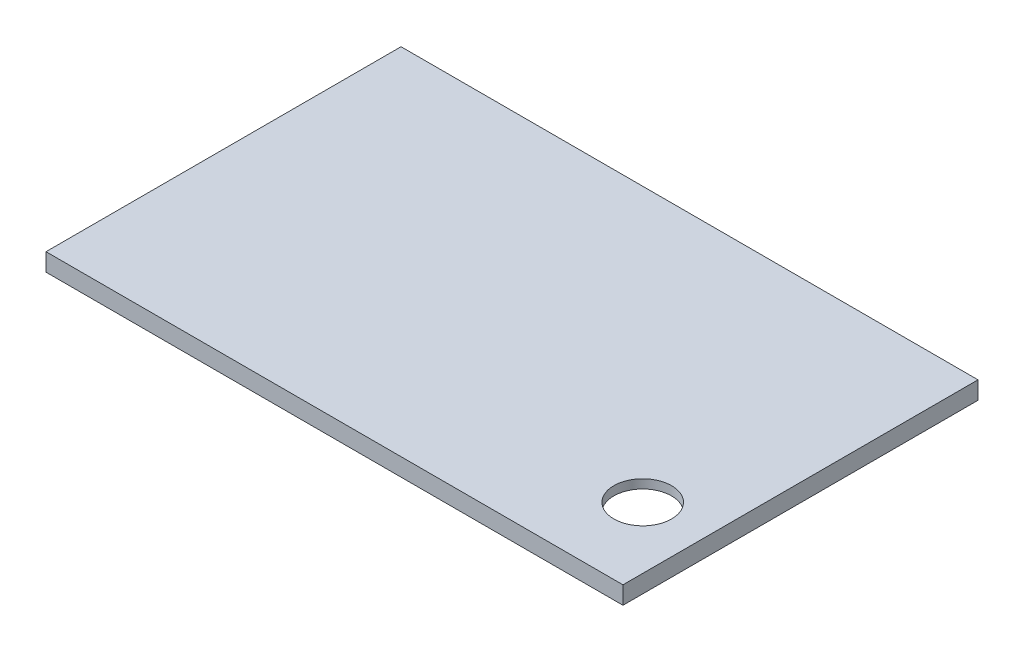
ISO-10303-21;
HEADER;
FILE_DESCRIPTION(('STEP AP214'),'2;1');
FILE_NAME('part.step','',(''),(''),'','','');
FILE_SCHEMA(('AUTOMOTIVE_DESIGN { 1 0 10303 214 1 1 1 1 }'));
ENDSEC;
DATA;
#1=APPLICATION_CONTEXT('core data for automotive mechanical design processes');
#2=APPLICATION_PROTOCOL_DEFINITION('international standard','automotive_design',2000,#1);
#3=PRODUCT_CONTEXT('',#1,'mechanical');
#4=PRODUCT('Part','Part','',(#3));
#5=PRODUCT_RELATED_PRODUCT_CATEGORY('part','',(#4));
#6=PRODUCT_DEFINITION_FORMATION('','',#4);
#7=PRODUCT_DEFINITION_CONTEXT('part definition',#1,'design');
#8=PRODUCT_DEFINITION('design','',#6,#7);
#9=PRODUCT_DEFINITION_SHAPE('','',#8);
#10=(LENGTH_UNIT() NAMED_UNIT(*) SI_UNIT(.MILLI.,.METRE.));
#11=(NAMED_UNIT(*) PLANE_ANGLE_UNIT() SI_UNIT($,.RADIAN.));
#12=(NAMED_UNIT(*) SI_UNIT($,.STERADIAN.) SOLID_ANGLE_UNIT());
#13=UNCERTAINTY_MEASURE_WITH_UNIT(LENGTH_MEASURE(1.E-05),#10,'distance_accuracy_value','');
#14=(GEOMETRIC_REPRESENTATION_CONTEXT(3) GLOBAL_UNCERTAINTY_ASSIGNED_CONTEXT((#13)) GLOBAL_UNIT_ASSIGNED_CONTEXT((#10,
#11,#12)) REPRESENTATION_CONTEXT('',''));
#15=CARTESIAN_POINT('',(0.,0.,0.));
#16=DIRECTION('',(0.,0.,1.));
#17=DIRECTION('',(1.,0.,0.));
#18=AXIS2_PLACEMENT_3D('',#15,#16,#17);
#19=CARTESIAN_POINT('',(32.5,45.,20.));
#20=DIRECTION('',(-1.,0.,0.));
#21=DIRECTION('',(0.,0.,1.));
#22=AXIS2_PLACEMENT_3D('',#19,#20,#21);
#23=PLANE('',#22);
#24=DIRECTION('',(0.,-1.,0.));
#25=VECTOR('',#24,1.);
#26=CARTESIAN_POINT('',(32.5,45.,20.));
#27=LINE('',#26,#25);
#28=CARTESIAN_POINT('',(32.5,46.,20.));
#29=VERTEX_POINT('',#28);
#30=CARTESIAN_POINT('',(32.5,44.,20.));
#31=VERTEX_POINT('',#30);
#32=EDGE_CURVE('E133',#29,#31,#27,.T.);
#33=ORIENTED_EDGE('',*,*,#32,.T.);
#34=DIRECTION('',(0.,0.,-1.));
#35=VECTOR('',#34,1.);
#36=CARTESIAN_POINT('',(32.5,44.,20.));
#37=LINE('',#36,#35);
#38=CARTESIAN_POINT('',(32.5,44.,-20.));
#39=VERTEX_POINT('',#38);
#40=EDGE_CURVE('E50',#31,#39,#37,.T.);
#41=ORIENTED_EDGE('',*,*,#40,.T.);
#42=DIRECTION('',(0.,-1.,0.));
#43=VECTOR('',#42,1.);
#44=CARTESIAN_POINT('',(32.5,45.,-20.));
#45=LINE('',#44,#43);
#46=CARTESIAN_POINT('',(32.5,46.,-20.));
#47=VERTEX_POINT('',#46);
#48=EDGE_CURVE('E191',#47,#39,#45,.T.);
#49=ORIENTED_EDGE('',*,*,#48,.F.);
#50=DIRECTION('',(0.,0.,-1.));
#51=VECTOR('',#50,1.);
#52=CARTESIAN_POINT('',(32.5,46.,-20.));
#53=LINE('',#52,#51);
#54=EDGE_CURVE('E142',#29,#47,#53,.T.);
#55=ORIENTED_EDGE('',*,*,#54,.F.);
#56=EDGE_LOOP('',(#33,#41,#49,#55));
#57=FACE_BOUND('',#56,.T.);
#58=ADVANCED_FACE('F35',(#57),#23,.F.);
#59=CARTESIAN_POINT('',(-32.5,45.,-20.));
#60=DIRECTION('',(0.,0.,1.));
#61=DIRECTION('',(1.,0.,0.));
#62=AXIS2_PLACEMENT_3D('',#59,#60,#61);
#63=PLANE('',#62);
#64=ORIENTED_EDGE('',*,*,#48,.T.);
#65=DIRECTION('',(-1.,0.,0.));
#66=VECTOR('',#65,1.);
#67=CARTESIAN_POINT('',(-32.5,44.,-20.));
#68=LINE('',#67,#66);
#69=CARTESIAN_POINT('',(-32.5,44.,-20.));
#70=VERTEX_POINT('',#69);
#71=EDGE_CURVE('E176',#39,#70,#68,.T.);
#72=ORIENTED_EDGE('',*,*,#71,.T.);
#73=DIRECTION('',(0.,-1.,0.));
#74=VECTOR('',#73,1.);
#75=CARTESIAN_POINT('',(-32.5,45.,-20.));
#76=LINE('',#75,#74);
#77=CARTESIAN_POINT('',(-32.5,46.,-20.));
#78=VERTEX_POINT('',#77);
#79=EDGE_CURVE('E132',#78,#70,#76,.T.);
#80=ORIENTED_EDGE('',*,*,#79,.F.);
#81=DIRECTION('',(-1.,0.,0.));
#82=VECTOR('',#81,1.);
#83=CARTESIAN_POINT('',(-32.5,46.,-20.));
#84=LINE('',#83,#82);
#85=EDGE_CURVE('E147',#47,#78,#84,.T.);
#86=ORIENTED_EDGE('',*,*,#85,.F.);
#87=EDGE_LOOP('',(#64,#72,#80,#86));
#88=FACE_BOUND('',#87,.T.);
#89=ADVANCED_FACE('F268',(#88),#63,.F.);
#90=CARTESIAN_POINT('',(-32.5,45.,20.));
#91=DIRECTION('',(1.,0.,0.));
#92=DIRECTION('',(0.,0.,-1.));
#93=AXIS2_PLACEMENT_3D('',#90,#91,#92);
#94=PLANE('',#93);
#95=ORIENTED_EDGE('',*,*,#79,.T.);
#96=DIRECTION('',(0.,0.,1.));
#97=VECTOR('',#96,1.);
#98=CARTESIAN_POINT('',(-32.5,44.,-230.));
#99=LINE('',#98,#97);
#100=CARTESIAN_POINT('',(-32.5,44.,20.));
#101=VERTEX_POINT('',#100);
#102=EDGE_CURVE('E130',#70,#101,#99,.T.);
#103=ORIENTED_EDGE('',*,*,#102,.T.);
#104=DIRECTION('',(0.,-1.,0.));
#105=VECTOR('',#104,1.);
#106=CARTESIAN_POINT('',(-32.5,45.,20.));
#107=LINE('',#106,#105);
#108=CARTESIAN_POINT('',(-32.5,46.,20.));
#109=VERTEX_POINT('',#108);
#110=EDGE_CURVE('E124',#109,#101,#107,.T.);
#111=ORIENTED_EDGE('',*,*,#110,.F.);
#112=DIRECTION('',(0.,0.,1.));
#113=VECTOR('',#112,1.);
#114=CARTESIAN_POINT('',(-32.5,46.,-20.));
#115=LINE('',#114,#113);
#116=EDGE_CURVE('E129',#78,#109,#115,.T.);
#117=ORIENTED_EDGE('',*,*,#116,.F.);
#118=EDGE_LOOP('',(#95,#103,#111,#117));
#119=FACE_BOUND('',#118,.T.);
#120=ADVANCED_FACE('F127',(#119),#94,.F.);
#121=CARTESIAN_POINT('',(-32.5,45.,20.));
#122=DIRECTION('',(0.,0.,-1.));
#123=DIRECTION('',(-1.,0.,0.));
#124=AXIS2_PLACEMENT_3D('',#121,#122,#123);
#125=PLANE('',#124);
#126=ORIENTED_EDGE('',*,*,#110,.T.);
#127=DIRECTION('',(-1.,0.,0.));
#128=VECTOR('',#127,1.);
#129=CARTESIAN_POINT('',(-32.5,44.,20.));
#130=LINE('',#129,#128);
#131=EDGE_CURVE('E157',#31,#101,#130,.T.);
#132=ORIENTED_EDGE('',*,*,#131,.F.);
#133=ORIENTED_EDGE('',*,*,#32,.F.);
#134=DIRECTION('',(1.,0.,0.));
#135=VECTOR('',#134,1.);
#136=CARTESIAN_POINT('',(-32.5,46.,20.));
#137=LINE('',#136,#135);
#138=EDGE_CURVE('E136',#109,#29,#137,.T.);
#139=ORIENTED_EDGE('',*,*,#138,.F.);
#140=EDGE_LOOP('',(#126,#132,#133,#139));
#141=FACE_BOUND('',#140,.T.);
#142=ADVANCED_FACE('F137',(#141),#125,.F.);
#143=CARTESIAN_POINT('',(31.5,45.,20.));
#144=DIRECTION('',(-1.,0.,0.));
#145=DIRECTION('',(0.,0.,1.));
#146=AXIS2_PLACEMENT_3D('',#143,#144,#145);
#147=PLANE('',#146);
#148=DIRECTION('',(0.,0.,-1.));
#149=VECTOR('',#148,1.);
#150=CARTESIAN_POINT('',(31.5,44.,20.));
#151=LINE('',#150,#149);
#152=CARTESIAN_POINT('',(31.5,44.,16.5));
#153=VERTEX_POINT('',#152);
#154=CARTESIAN_POINT('',(31.5,44.,-16.5));
#155=VERTEX_POINT('',#154);
#156=EDGE_CURVE('E161',#153,#155,#151,.T.);
#157=ORIENTED_EDGE('',*,*,#156,.F.);
#158=DIRECTION('',(0.,-1.,0.));
#159=VECTOR('',#158,1.);
#160=CARTESIAN_POINT('',(31.5,45.,16.5));
#161=LINE('',#160,#159);
#162=CARTESIAN_POINT('',(31.5,45.,16.5));
#163=VERTEX_POINT('',#162);
#164=EDGE_CURVE('E202',#153,#163,#161,.F.);
#165=ORIENTED_EDGE('',*,*,#164,.T.);
#166=DIRECTION('',(0.,0.,-1.));
#167=VECTOR('',#166,1.);
#168=CARTESIAN_POINT('',(31.5,45.,0.));
#169=LINE('',#168,#167);
#170=CARTESIAN_POINT('',(31.5,45.,-16.5));
#171=VERTEX_POINT('',#170);
#172=EDGE_CURVE('E180',#163,#171,#169,.T.);
#173=ORIENTED_EDGE('',*,*,#172,.T.);
#174=DIRECTION('',(0.,-1.,0.));
#175=VECTOR('',#174,1.);
#176=CARTESIAN_POINT('',(31.5,3.,-16.5));
#177=LINE('',#176,#175);
#178=EDGE_CURVE('E199',#171,#155,#177,.T.);
#179=ORIENTED_EDGE('',*,*,#178,.T.);
#180=EDGE_LOOP('',(#157,#165,#173,#179));
#181=FACE_BOUND('',#180,.T.);
#182=ADVANCED_FACE('F251',(#181),#147,.T.);
#183=CARTESIAN_POINT('',(-32.5,45.,-19.));
#184=DIRECTION('',(0.,0.,1.));
#185=DIRECTION('',(1.,0.,0.));
#186=AXIS2_PLACEMENT_3D('',#183,#184,#185);
#187=PLANE('',#186);
#188=DIRECTION('',(-1.,0.,0.));
#189=VECTOR('',#188,1.);
#190=CARTESIAN_POINT('',(-32.5,44.,-19.));
#191=LINE('',#190,#189);
#192=CARTESIAN_POINT('',(29.,44.,-19.));
#193=VERTEX_POINT('',#192);
#194=CARTESIAN_POINT('',(-29.,44.,-19.));
#195=VERTEX_POINT('',#194);
#196=EDGE_CURVE('E171',#193,#195,#191,.T.);
#197=ORIENTED_EDGE('',*,*,#196,.F.);
#198=DIRECTION('',(0.,-1.,0.));
#199=VECTOR('',#198,1.);
#200=CARTESIAN_POINT('',(29.,45.,-19.));
#201=LINE('',#200,#199);
#202=CARTESIAN_POINT('',(29.,45.,-19.));
#203=VERTEX_POINT('',#202);
#204=EDGE_CURVE('E207',#193,#203,#201,.F.);
#205=ORIENTED_EDGE('',*,*,#204,.T.);
#206=DIRECTION('',(-1.,0.,0.));
#207=VECTOR('',#206,1.);
#208=CARTESIAN_POINT('',(0.,45.,-19.));
#209=LINE('',#208,#207);
#210=CARTESIAN_POINT('',(-29.,45.,-19.));
#211=VERTEX_POINT('',#210);
#212=EDGE_CURVE('E183',#203,#211,#209,.T.);
#213=ORIENTED_EDGE('',*,*,#212,.T.);
#214=DIRECTION('',(0.,-1.,0.));
#215=VECTOR('',#214,1.);
#216=CARTESIAN_POINT('',(-29.,3.,-19.));
#217=LINE('',#216,#215);
#218=EDGE_CURVE('E204',#211,#195,#217,.T.);
#219=ORIENTED_EDGE('',*,*,#218,.T.);
#220=EDGE_LOOP('',(#197,#205,#213,#219));
#221=FACE_BOUND('',#220,.T.);
#222=ADVANCED_FACE('F245',(#221),#187,.T.);
#223=CARTESIAN_POINT('',(-31.5,45.,20.));
#224=DIRECTION('',(1.,0.,0.));
#225=DIRECTION('',(0.,0.,-1.));
#226=AXIS2_PLACEMENT_3D('',#223,#224,#225);
#227=PLANE('',#226);
#228=DIRECTION('',(0.,0.,1.));
#229=VECTOR('',#228,1.);
#230=CARTESIAN_POINT('',(-31.5,44.,20.));
#231=LINE('',#230,#229);
#232=CARTESIAN_POINT('',(-31.5,44.,-16.5));
#233=VERTEX_POINT('',#232);
#234=CARTESIAN_POINT('',(-31.5,44.,16.5));
#235=VERTEX_POINT('',#234);
#236=EDGE_CURVE('E169',#233,#235,#231,.T.);
#237=ORIENTED_EDGE('',*,*,#236,.F.);
#238=DIRECTION('',(0.,-1.,0.));
#239=VECTOR('',#238,1.);
#240=CARTESIAN_POINT('',(-31.5,45.,-16.5));
#241=LINE('',#240,#239);
#242=CARTESIAN_POINT('',(-31.5,45.,-16.5));
#243=VERTEX_POINT('',#242);
#244=EDGE_CURVE('E212',#233,#243,#241,.F.);
#245=ORIENTED_EDGE('',*,*,#244,.T.);
#246=DIRECTION('',(0.,0.,1.));
#247=VECTOR('',#246,1.);
#248=CARTESIAN_POINT('',(-31.5,45.,0.));
#249=LINE('',#248,#247);
#250=CARTESIAN_POINT('',(-31.5,45.,16.5));
#251=VERTEX_POINT('',#250);
#252=EDGE_CURVE('E185',#243,#251,#249,.T.);
#253=ORIENTED_EDGE('',*,*,#252,.T.);
#254=DIRECTION('',(0.,-1.,0.));
#255=VECTOR('',#254,1.);
#256=CARTESIAN_POINT('',(-31.5,3.,16.5));
#257=LINE('',#256,#255);
#258=EDGE_CURVE('E209',#251,#235,#257,.T.);
#259=ORIENTED_EDGE('',*,*,#258,.T.);
#260=EDGE_LOOP('',(#237,#245,#253,#259));
#261=FACE_BOUND('',#260,.T.);
#262=ADVANCED_FACE('F235',(#261),#227,.T.);
#263=CARTESIAN_POINT('',(-32.5,45.,19.));
#264=DIRECTION('',(0.,0.,-1.));
#265=DIRECTION('',(-1.,0.,0.));
#266=AXIS2_PLACEMENT_3D('',#263,#264,#265);
#267=PLANE('',#266);
#268=DIRECTION('',(1.,0.,0.));
#269=VECTOR('',#268,1.);
#270=CARTESIAN_POINT('',(-32.5,44.,19.));
#271=LINE('',#270,#269);
#272=CARTESIAN_POINT('',(-29.,44.,19.));
#273=VERTEX_POINT('',#272);
#274=CARTESIAN_POINT('',(29.,44.,19.));
#275=VERTEX_POINT('',#274);
#276=EDGE_CURVE('E58',#273,#275,#271,.T.);
#277=ORIENTED_EDGE('',*,*,#276,.F.);
#278=DIRECTION('',(0.,-1.,0.));
#279=VECTOR('',#278,1.);
#280=CARTESIAN_POINT('',(-29.,45.,19.));
#281=LINE('',#280,#279);
#282=CARTESIAN_POINT('',(-29.,45.,19.));
#283=VERTEX_POINT('',#282);
#284=EDGE_CURVE('E194',#273,#283,#281,.F.);
#285=ORIENTED_EDGE('',*,*,#284,.T.);
#286=DIRECTION('',(1.,0.,0.));
#287=VECTOR('',#286,1.);
#288=CARTESIAN_POINT('',(0.,45.,19.));
#289=LINE('',#288,#287);
#290=CARTESIAN_POINT('',(29.,45.,19.));
#291=VERTEX_POINT('',#290);
#292=EDGE_CURVE('E187',#283,#291,#289,.T.);
#293=ORIENTED_EDGE('',*,*,#292,.T.);
#294=DIRECTION('',(0.,-1.,0.));
#295=VECTOR('',#294,1.);
#296=CARTESIAN_POINT('',(29.,3.,19.));
#297=LINE('',#296,#295);
#298=EDGE_CURVE('E196',#291,#275,#297,.T.);
#299=ORIENTED_EDGE('',*,*,#298,.T.);
#300=EDGE_LOOP('',(#277,#285,#293,#299));
#301=FACE_BOUND('',#300,.T.);
#302=ADVANCED_FACE('F257',(#301),#267,.T.);
#303=CARTESIAN_POINT('',(-29.,45.,16.5));
#304=DIRECTION('',(0.,1.,0.));
#305=DIRECTION('',(0.,0.,1.));
#306=AXIS2_PLACEMENT_3D('',#303,#304,#305);
#307=CYLINDRICAL_SURFACE('',#306,2.5);
#308=ORIENTED_EDGE('',*,*,#284,.F.);
#309=CARTESIAN_POINT('',(-29.,44.,16.5));
#310=DIRECTION('',(0.,1.,0.));
#311=DIRECTION('',(0.,0.,1.));
#312=AXIS2_PLACEMENT_3D('',#309,#310,#311);
#313=CIRCLE('',#312,2.5);
#314=EDGE_CURVE('E166',#273,#235,#313,.F.);
#315=ORIENTED_EDGE('',*,*,#314,.T.);
#316=ORIENTED_EDGE('',*,*,#258,.F.);
#317=CARTESIAN_POINT('',(-29.,45.,16.5));
#318=DIRECTION('',(0.,-1.,0.));
#319=DIRECTION('',(0.,0.,-1.));
#320=AXIS2_PLACEMENT_3D('',#317,#318,#319);
#321=CIRCLE('',#320,2.5);
#322=EDGE_CURVE('E43',#283,#251,#321,.T.);
#323=ORIENTED_EDGE('',*,*,#322,.F.);
#324=EDGE_LOOP('',(#308,#315,#316,#323));
#325=FACE_BOUND('',#324,.T.);
#326=ADVANCED_FACE('F232',(#325),#307,.F.);
#327=CARTESIAN_POINT('',(-29.,45.,-16.5));
#328=DIRECTION('',(0.,1.,0.));
#329=DIRECTION('',(0.,0.,1.));
#330=AXIS2_PLACEMENT_3D('',#327,#328,#329);
#331=CYLINDRICAL_SURFACE('',#330,2.5);
#332=ORIENTED_EDGE('',*,*,#244,.F.);
#333=CARTESIAN_POINT('',(-29.,44.,-16.5));
#334=DIRECTION('',(0.,1.,0.));
#335=DIRECTION('',(0.,0.,1.));
#336=AXIS2_PLACEMENT_3D('',#333,#334,#335);
#337=CIRCLE('',#336,2.5);
#338=EDGE_CURVE('E173',#233,#195,#337,.F.);
#339=ORIENTED_EDGE('',*,*,#338,.T.);
#340=ORIENTED_EDGE('',*,*,#218,.F.);
#341=CARTESIAN_POINT('',(-29.,45.,-16.5));
#342=DIRECTION('',(0.,-1.,0.));
#343=DIRECTION('',(0.,0.,-1.));
#344=AXIS2_PLACEMENT_3D('',#341,#342,#343);
#345=CIRCLE('',#344,2.5);
#346=EDGE_CURVE('E220',#243,#211,#345,.T.);
#347=ORIENTED_EDGE('',*,*,#346,.F.);
#348=EDGE_LOOP('',(#332,#339,#340,#347));
#349=FACE_BOUND('',#348,.T.);
#350=ADVANCED_FACE('F240',(#349),#331,.F.);
#351=CARTESIAN_POINT('',(29.,45.,-16.5));
#352=DIRECTION('',(0.,1.,0.));
#353=DIRECTION('',(0.,0.,1.));
#354=AXIS2_PLACEMENT_3D('',#351,#352,#353);
#355=CYLINDRICAL_SURFACE('',#354,2.5);
#356=ORIENTED_EDGE('',*,*,#204,.F.);
#357=CARTESIAN_POINT('',(29.,44.,-16.5));
#358=DIRECTION('',(0.,1.,0.));
#359=DIRECTION('',(0.,0.,1.));
#360=AXIS2_PLACEMENT_3D('',#357,#358,#359);
#361=CIRCLE('',#360,2.5);
#362=EDGE_CURVE('E163',#193,#155,#361,.F.);
#363=ORIENTED_EDGE('',*,*,#362,.T.);
#364=ORIENTED_EDGE('',*,*,#178,.F.);
#365=CARTESIAN_POINT('',(29.,45.,-16.5));
#366=DIRECTION('',(0.,-1.,0.));
#367=DIRECTION('',(0.,0.,-1.));
#368=AXIS2_PLACEMENT_3D('',#365,#366,#367);
#369=CIRCLE('',#368,2.5);
#370=EDGE_CURVE('E217',#203,#171,#369,.T.);
#371=ORIENTED_EDGE('',*,*,#370,.F.);
#372=EDGE_LOOP('',(#356,#363,#364,#371));
#373=FACE_BOUND('',#372,.T.);
#374=ADVANCED_FACE('F248',(#373),#355,.F.);
#375=CARTESIAN_POINT('',(29.,45.,16.5));
#376=DIRECTION('',(0.,1.,0.));
#377=DIRECTION('',(0.,0.,1.));
#378=AXIS2_PLACEMENT_3D('',#375,#376,#377);
#379=CYLINDRICAL_SURFACE('',#378,2.5);
#380=ORIENTED_EDGE('',*,*,#164,.F.);
#381=CARTESIAN_POINT('',(29.,44.,16.5));
#382=DIRECTION('',(0.,1.,0.));
#383=DIRECTION('',(0.,0.,1.));
#384=AXIS2_PLACEMENT_3D('',#381,#382,#383);
#385=CIRCLE('',#384,2.5);
#386=EDGE_CURVE('E11',#153,#275,#385,.F.);
#387=ORIENTED_EDGE('',*,*,#386,.T.);
#388=ORIENTED_EDGE('',*,*,#298,.F.);
#389=CARTESIAN_POINT('',(29.,45.,16.5));
#390=DIRECTION('',(0.,-1.,0.));
#391=DIRECTION('',(0.,0.,-1.));
#392=AXIS2_PLACEMENT_3D('',#389,#390,#391);
#393=CIRCLE('',#392,2.5);
#394=EDGE_CURVE('E214',#163,#291,#393,.T.);
#395=ORIENTED_EDGE('',*,*,#394,.F.);
#396=EDGE_LOOP('',(#380,#387,#388,#395));
#397=FACE_BOUND('',#396,.T.);
#398=ADVANCED_FACE('F37',(#397),#379,.F.);
#399=CARTESIAN_POINT('',(-32.5,44.,-230.));
#400=DIRECTION('',(0.,1.,0.));
#401=DIRECTION('',(0.,0.,1.));
#402=AXIS2_PLACEMENT_3D('',#399,#400,#401);
#403=PLANE('',#402);
#404=ORIENTED_EDGE('',*,*,#236,.T.);
#405=ORIENTED_EDGE('',*,*,#314,.F.);
#406=ORIENTED_EDGE('',*,*,#276,.T.);
#407=ORIENTED_EDGE('',*,*,#386,.F.);
#408=ORIENTED_EDGE('',*,*,#156,.T.);
#409=ORIENTED_EDGE('',*,*,#362,.F.);
#410=ORIENTED_EDGE('',*,*,#196,.T.);
#411=ORIENTED_EDGE('',*,*,#338,.F.);
#412=EDGE_LOOP('',(#404,#405,#406,#407,#408,#409,#410,#411));
#413=FACE_BOUND('',#412,.T.);
#414=ORIENTED_EDGE('',*,*,#131,.T.);
#415=ORIENTED_EDGE('',*,*,#102,.F.);
#416=ORIENTED_EDGE('',*,*,#71,.F.);
#417=ORIENTED_EDGE('',*,*,#40,.F.);
#418=EDGE_LOOP('',(#414,#415,#416,#417));
#419=FACE_BOUND('',#418,.T.);
#420=ADVANCED_FACE('F283',(#413,#419),#403,.F.);
#421=CARTESIAN_POINT('',(0.,45.,0.));
#422=DIRECTION('',(0.,1.,0.));
#423=DIRECTION('',(0.,0.,1.));
#424=AXIS2_PLACEMENT_3D('',#421,#422,#423);
#425=PLANE('',#424);
#426=CARTESIAN_POINT('',(25.5642796309914,45.,10.8385156081567));
#427=DIRECTION('',(0.,1.,0.));
#428=DIRECTION('',(0.,0.,1.));
#429=AXIS2_PLACEMENT_3D('',#426,#427,#428);
#430=CIRCLE('',#429,3.25);
#431=CARTESIAN_POINT('',(25.5642796309914,45.,14.0885156081567));
#432=VERTEX_POINT('',#431);
#433=EDGE_CURVE('E148',#432,#432,#430,.T.);
#434=ORIENTED_EDGE('',*,*,#433,.T.);
#435=EDGE_LOOP('',(#434));
#436=FACE_BOUND('',#435,.T.);
#437=ORIENTED_EDGE('',*,*,#172,.F.);
#438=ORIENTED_EDGE('',*,*,#394,.T.);
#439=ORIENTED_EDGE('',*,*,#292,.F.);
#440=ORIENTED_EDGE('',*,*,#322,.T.);
#441=ORIENTED_EDGE('',*,*,#252,.F.);
#442=ORIENTED_EDGE('',*,*,#346,.T.);
#443=ORIENTED_EDGE('',*,*,#212,.F.);
#444=ORIENTED_EDGE('',*,*,#370,.T.);
#445=EDGE_LOOP('',(#437,#438,#439,#440,#441,#442,#443,#444));
#446=FACE_BOUND('',#445,.T.);
#447=ADVANCED_FACE('F228',(#436,#446),#425,.F.);
#448=CARTESIAN_POINT('',(0.,46.,0.));
#449=DIRECTION('',(0.,1.,0.));
#450=DIRECTION('',(0.,0.,1.));
#451=AXIS2_PLACEMENT_3D('',#448,#449,#450);
#452=PLANE('',#451);
#453=CARTESIAN_POINT('',(25.5642796309914,46.,10.8385156081567));
#454=DIRECTION('',(0.,1.,0.));
#455=DIRECTION('',(0.,0.,1.));
#456=AXIS2_PLACEMENT_3D('',#453,#454,#455);
#457=CIRCLE('',#456,3.25);
#458=CARTESIAN_POINT('',(25.5642796309914,46.,14.0885156081567));
#459=VERTEX_POINT('',#458);
#460=EDGE_CURVE('E151',#459,#459,#457,.T.);
#461=ORIENTED_EDGE('',*,*,#460,.F.);
#462=EDGE_LOOP('',(#461));
#463=FACE_BOUND('',#462,.T.);
#464=ORIENTED_EDGE('',*,*,#116,.T.);
#465=ORIENTED_EDGE('',*,*,#138,.T.);
#466=ORIENTED_EDGE('',*,*,#54,.T.);
#467=ORIENTED_EDGE('',*,*,#85,.T.);
#468=EDGE_LOOP('',(#464,#465,#466,#467));
#469=FACE_BOUND('',#468,.T.);
#470=ADVANCED_FACE('F145',(#463,#469),#452,.T.);
#471=CARTESIAN_POINT('',(25.5642796309914,39.,10.8385156081567));
#472=DIRECTION('',(0.,1.,0.));
#473=DIRECTION('',(0.,0.,1.));
#474=AXIS2_PLACEMENT_3D('',#471,#472,#473);
#475=CYLINDRICAL_SURFACE('',#474,3.25);
#476=ORIENTED_EDGE('',*,*,#460,.T.);
#477=EDGE_LOOP('',(#476));
#478=FACE_BOUND('',#477,.T.);
#479=ORIENTED_EDGE('',*,*,#433,.F.);
#480=EDGE_LOOP('',(#479));
#481=FACE_BOUND('',#480,.T.);
#482=ADVANCED_FACE('F348',(#478,#481),#475,.F.);
#483=CLOSED_SHELL('',(#58,#89,#120,#142,#182,#222,#262,#302,#326,#350,#374,#398,#420,#447,#470,#482));
#484=MANIFOLD_SOLID_BREP('B2',#483);
#485=ADVANCED_BREP_SHAPE_REPRESENTATION('',(#18,#484),#14);
#486=SHAPE_DEFINITION_REPRESENTATION(#9,#485);
ENDSEC;
END-ISO-10303-21;
